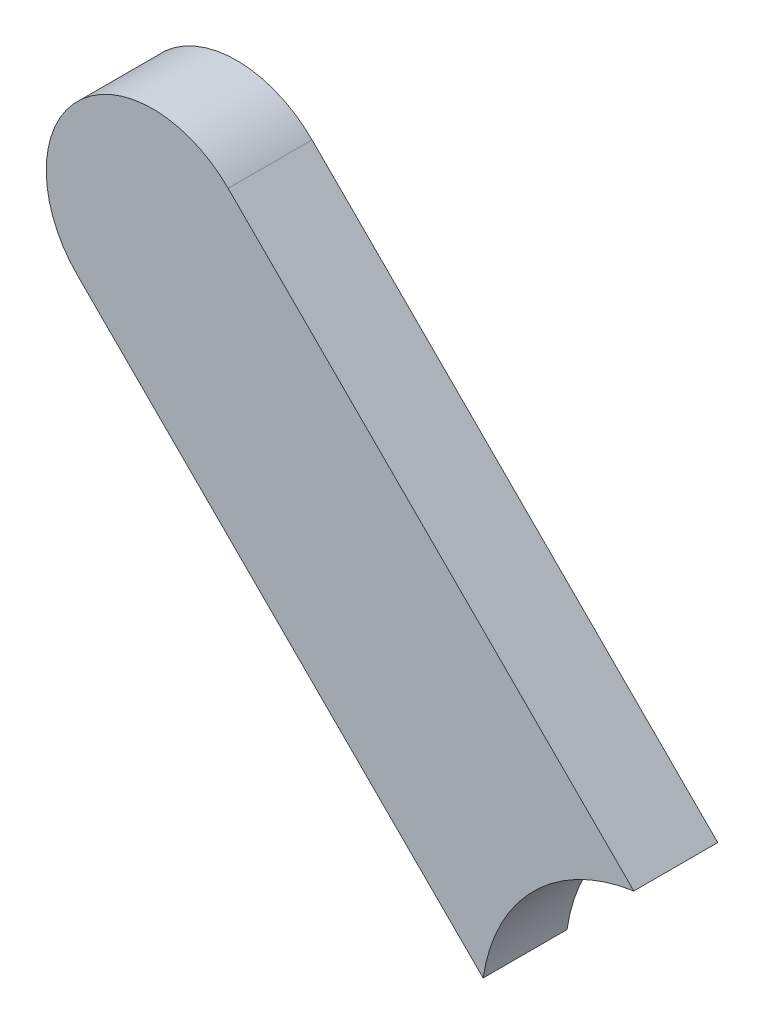
ISO-10303-21;
HEADER;
FILE_DESCRIPTION(('STEP AP214'),'2;1');
FILE_NAME('part.step','',(''),(''),'','','');
FILE_SCHEMA(('AUTOMOTIVE_DESIGN { 1 0 10303 214 1 1 1 1 }'));
ENDSEC;
DATA;
#1=APPLICATION_CONTEXT('core data for automotive mechanical design processes');
#2=APPLICATION_PROTOCOL_DEFINITION('international standard','automotive_design',2000,#1);
#3=PRODUCT_CONTEXT('',#1,'mechanical');
#4=PRODUCT('Part','Part','',(#3));
#5=PRODUCT_RELATED_PRODUCT_CATEGORY('part','',(#4));
#6=PRODUCT_DEFINITION_FORMATION('','',#4);
#7=PRODUCT_DEFINITION_CONTEXT('part definition',#1,'design');
#8=PRODUCT_DEFINITION('design','',#6,#7);
#9=PRODUCT_DEFINITION_SHAPE('','',#8);
#10=(LENGTH_UNIT() NAMED_UNIT(*) SI_UNIT(.MILLI.,.METRE.));
#11=(NAMED_UNIT(*) PLANE_ANGLE_UNIT() SI_UNIT($,.RADIAN.));
#12=(NAMED_UNIT(*) SI_UNIT($,.STERADIAN.) SOLID_ANGLE_UNIT());
#13=UNCERTAINTY_MEASURE_WITH_UNIT(LENGTH_MEASURE(1.E-05),#10,'distance_accuracy_value','');
#14=(GEOMETRIC_REPRESENTATION_CONTEXT(3) GLOBAL_UNCERTAINTY_ASSIGNED_CONTEXT((#13)) GLOBAL_UNIT_ASSIGNED_CONTEXT((#10,
#11,#12)) REPRESENTATION_CONTEXT('',''));
#15=CARTESIAN_POINT('',(0.,0.,0.));
#16=DIRECTION('',(0.,0.,1.));
#17=DIRECTION('',(1.,0.,0.));
#18=AXIS2_PLACEMENT_3D('',#15,#16,#17);
#19=CARTESIAN_POINT('',(133.61339546,119.7733952,0.));
#20=DIRECTION('',(0.707106781186549,0.707106781186546,0.));
#21=DIRECTION('',(0.707106781186546,-0.707106781186549,0.));
#22=AXIS2_PLACEMENT_3D('',#19,#20,#21);
#23=PLANE('',#22);
#24=DIRECTION('',(0.707106781186546,-0.707106781186549,0.));
#25=VECTOR('',#24,1.);
#26=CARTESIAN_POINT('',(133.61339546,119.7733952,0.1999996));
#27=LINE('',#26,#25);
#28=CARTESIAN_POINT('',(133.61339546,119.7733952,0.1999996));
#29=VERTEX_POINT('',#28);
#30=CARTESIAN_POINT('',(134.580449607867,118.806341052133,0.1999996));
#31=VERTEX_POINT('',#30);
#32=EDGE_CURVE('E11',#29,#31,#27,.T.);
#33=ORIENTED_EDGE('',*,*,#32,.F.);
#34=DIRECTION('',(0.,0.,1.));
#35=VECTOR('',#34,1.);
#36=CARTESIAN_POINT('',(133.61339546,119.7733952,0.));
#37=LINE('',#36,#35);
#38=CARTESIAN_POINT('',(133.61339546,119.7733952,0.));
#39=VERTEX_POINT('',#38);
#40=EDGE_CURVE('E24',#39,#29,#37,.T.);
#41=ORIENTED_EDGE('',*,*,#40,.F.);
#42=DIRECTION('',(0.707106781186546,-0.707106781186549,0.));
#43=VECTOR('',#42,1.);
#44=CARTESIAN_POINT('',(133.61339546,119.7733952,0.));
#45=LINE('',#44,#43);
#46=CARTESIAN_POINT('',(134.580449607867,118.806341052133,0.));
#47=VERTEX_POINT('',#46);
#48=EDGE_CURVE('E75',#39,#47,#45,.T.);
#49=ORIENTED_EDGE('',*,*,#48,.T.);
#50=DIRECTION('',(0.,0.,1.));
#51=VECTOR('',#50,1.);
#52=CARTESIAN_POINT('',(134.580449607867,118.806341052133,0.));
#53=LINE('',#52,#51);
#54=EDGE_CURVE('E37',#47,#31,#53,.T.);
#55=ORIENTED_EDGE('',*,*,#54,.T.);
#56=EDGE_LOOP('',(#33,#41,#49,#55));
#57=FACE_BOUND('',#56,.T.);
#58=ADVANCED_FACE('F17',(#57),#23,.F.);
#59=CARTESIAN_POINT('',(135.001,118.745,0.));
#60=DIRECTION('',(0.,0.,-1.));
#61=DIRECTION('',(1.,0.,0.));
#62=AXIS2_PLACEMENT_3D('',#59,#60,#61);
#63=CYLINDRICAL_SURFACE('',#62,0.42500042);
#64=DIRECTION('',(0.,0.,1.));
#65=VECTOR('',#64,1.);
#66=CARTESIAN_POINT('',(134.93966116455,119.16555071545,0.));
#67=LINE('',#66,#65);
#68=CARTESIAN_POINT('',(134.93966116455,119.16555071545,0.));
#69=VERTEX_POINT('',#68);
#70=CARTESIAN_POINT('',(134.93966116455,119.16555071545,0.1999996));
#71=VERTEX_POINT('',#70);
#72=EDGE_CURVE('E67',#69,#71,#67,.T.);
#73=ORIENTED_EDGE('',*,*,#72,.T.);
#74=CARTESIAN_POINT('',(135.001,118.745,0.1999996));
#75=DIRECTION('',(0.,0.,1.));
#76=DIRECTION('',(1.,0.,0.));
#77=AXIS2_PLACEMENT_3D('',#74,#75,#76);
#78=CIRCLE('',#77,0.42500042);
#79=EDGE_CURVE('E82',#71,#31,#78,.T.);
#80=ORIENTED_EDGE('',*,*,#79,.T.);
#81=ORIENTED_EDGE('',*,*,#54,.F.);
#82=CARTESIAN_POINT('',(135.001,118.745,0.));
#83=DIRECTION('',(0.,0.,1.));
#84=DIRECTION('',(1.,0.,0.));
#85=AXIS2_PLACEMENT_3D('',#82,#83,#84);
#86=CIRCLE('',#85,0.42500042);
#87=EDGE_CURVE('E80',#69,#47,#86,.T.);
#88=ORIENTED_EDGE('',*,*,#87,.F.);
#89=EDGE_LOOP('',(#73,#80,#81,#88));
#90=FACE_BOUND('',#89,.T.);
#91=ADVANCED_FACE('F88',(#90),#63,.F.);
#92=CARTESIAN_POINT('',(134.93966116455,119.16555071545,0.));
#93=DIRECTION('',(-0.707106781186549,-0.707106781186546,0.));
#94=DIRECTION('',(-0.707106781186546,0.707106781186549,0.));
#95=AXIS2_PLACEMENT_3D('',#92,#93,#94);
#96=PLANE('',#95);
#97=DIRECTION('',(-0.707106781186546,0.707106781186549,0.));
#98=VECTOR('',#97,1.);
#99=CARTESIAN_POINT('',(138.86360594,115.24160594,0.1999996));
#100=LINE('',#99,#98);
#101=CARTESIAN_POINT('',(133.9726048,120.13260708,0.1999996));
#102=VERTEX_POINT('',#101);
#103=EDGE_CURVE('E71',#71,#102,#100,.T.);
#104=ORIENTED_EDGE('',*,*,#103,.F.);
#105=ORIENTED_EDGE('',*,*,#72,.F.);
#106=DIRECTION('',(-0.707106781186546,0.707106781186549,0.));
#107=VECTOR('',#106,1.);
#108=CARTESIAN_POINT('',(138.86360594,115.24160594,0.));
#109=LINE('',#108,#107);
#110=CARTESIAN_POINT('',(133.9726048,120.13260708,0.));
#111=VERTEX_POINT('',#110);
#112=EDGE_CURVE('E63',#69,#111,#109,.T.);
#113=ORIENTED_EDGE('',*,*,#112,.T.);
#114=DIRECTION('',(0.,0.,1.));
#115=VECTOR('',#114,1.);
#116=CARTESIAN_POINT('',(133.9726048,120.13260708,0.));
#117=LINE('',#116,#115);
#118=EDGE_CURVE('E53',#111,#102,#117,.T.);
#119=ORIENTED_EDGE('',*,*,#118,.T.);
#120=EDGE_LOOP('',(#104,#105,#113,#119));
#121=FACE_BOUND('',#120,.T.);
#122=ADVANCED_FACE('F66',(#121),#96,.F.);
#123=CARTESIAN_POINT('',(133.79300013,119.95300114,0.));
#124=DIRECTION('',(0.,0.,-1.));
#125=DIRECTION('',(0.7071042811847,0.707109281179556,0.));
#126=AXIS2_PLACEMENT_3D('',#123,#124,#125);
#127=CYLINDRICAL_SURFACE('',#126,0.254000258206737);
#128=CARTESIAN_POINT('',(133.79300013,119.95300114,0.1999996));
#129=DIRECTION('',(0.,0.,1.));
#130=DIRECTION('',(0.7071042811847,0.707109281179556,0.));
#131=AXIS2_PLACEMENT_3D('',#128,#129,#130);
#132=CIRCLE('',#131,0.254000258206737);
#133=EDGE_CURVE('E59',#102,#29,#132,.T.);
#134=ORIENTED_EDGE('',*,*,#133,.F.);
#135=ORIENTED_EDGE('',*,*,#118,.F.);
#136=CARTESIAN_POINT('',(133.79300013,119.95300114,0.));
#137=DIRECTION('',(0.,0.,1.));
#138=DIRECTION('',(0.7071042811847,0.707109281179556,0.));
#139=AXIS2_PLACEMENT_3D('',#136,#137,#138);
#140=CIRCLE('',#139,0.254000258206737);
#141=EDGE_CURVE('E57',#111,#39,#140,.T.);
#142=ORIENTED_EDGE('',*,*,#141,.T.);
#143=ORIENTED_EDGE('',*,*,#40,.T.);
#144=EDGE_LOOP('',(#134,#135,#142,#143));
#145=FACE_BOUND('',#144,.T.);
#146=ADVANCED_FACE('F55',(#145),#127,.T.);
#147=CARTESIAN_POINT('',(133.61339546,119.7733952,0.));
#148=DIRECTION('',(0.,0.,-1.));
#149=DIRECTION('',(-1.,0.,0.));
#150=AXIS2_PLACEMENT_3D('',#147,#148,#149);
#151=PLANE('',#150);
#152=ORIENTED_EDGE('',*,*,#48,.F.);
#153=ORIENTED_EDGE('',*,*,#141,.F.);
#154=ORIENTED_EDGE('',*,*,#112,.F.);
#155=ORIENTED_EDGE('',*,*,#87,.T.);
#156=EDGE_LOOP('',(#152,#153,#154,#155));
#157=FACE_BOUND('',#156,.T.);
#158=ADVANCED_FACE('F74',(#157),#151,.T.);
#159=CARTESIAN_POINT('',(133.61339546,119.7733952,0.1999996));
#160=DIRECTION('',(0.,0.,-1.));
#161=DIRECTION('',(-1.,0.,0.));
#162=AXIS2_PLACEMENT_3D('',#159,#160,#161);
#163=PLANE('',#162);
#164=ORIENTED_EDGE('',*,*,#133,.T.);
#165=ORIENTED_EDGE('',*,*,#32,.T.);
#166=ORIENTED_EDGE('',*,*,#79,.F.);
#167=ORIENTED_EDGE('',*,*,#103,.T.);
#168=EDGE_LOOP('',(#164,#165,#166,#167));
#169=FACE_BOUND('',#168,.T.);
#170=ADVANCED_FACE('F91',(#169),#163,.F.);
#171=CLOSED_SHELL('',(#58,#91,#122,#146,#158,#170));
#172=MANIFOLD_SOLID_BREP('B1',#171);
#173=ADVANCED_BREP_SHAPE_REPRESENTATION('',(#18,#172),#14);
#174=SHAPE_DEFINITION_REPRESENTATION(#9,#173);
ENDSEC;
END-ISO-10303-21;
